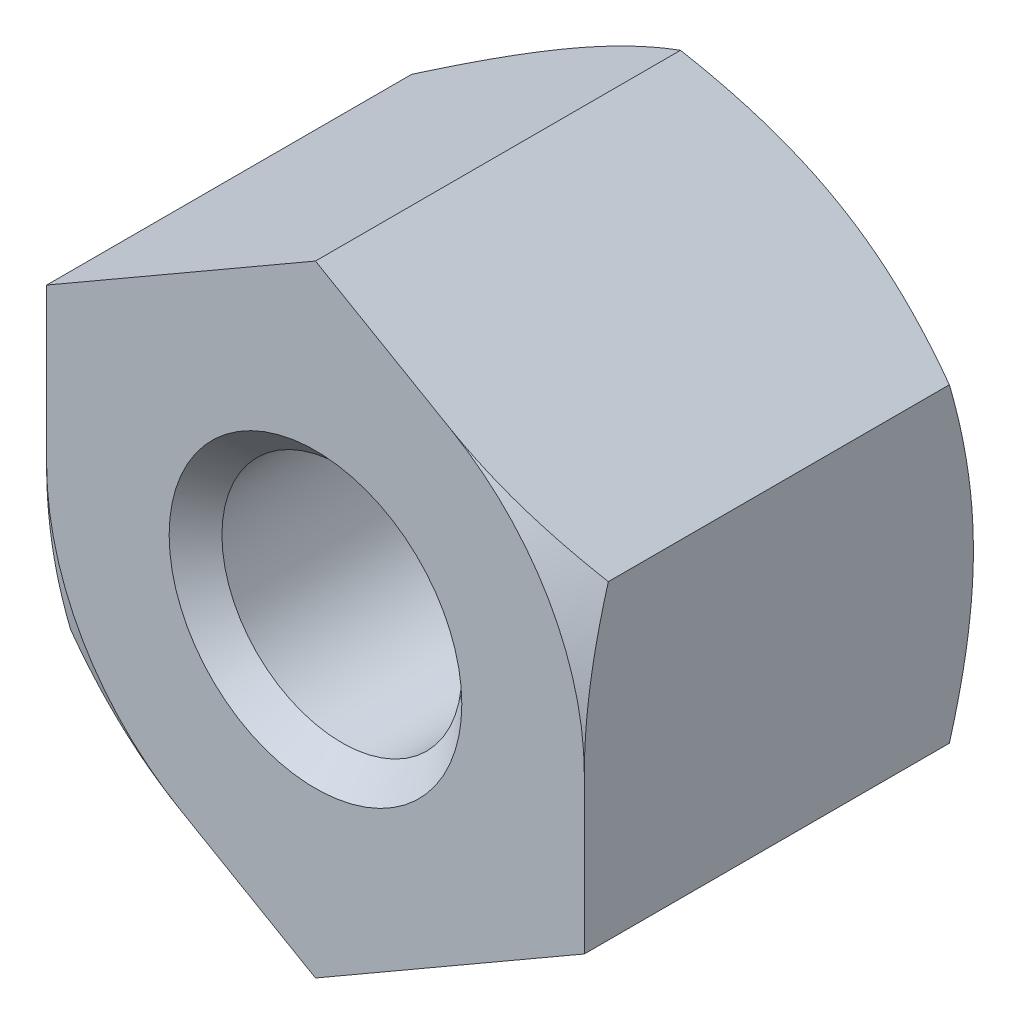
ISO-10303-21;
HEADER;
FILE_DESCRIPTION(('STEP AP214'),'2;1');
FILE_NAME('part.step','',(''),(''),'','','');
FILE_SCHEMA(('AUTOMOTIVE_DESIGN { 1 0 10303 214 1 1 1 1 }'));
ENDSEC;
DATA;
#1=APPLICATION_CONTEXT('core data for automotive mechanical design processes');
#2=APPLICATION_PROTOCOL_DEFINITION('international standard','automotive_design',2000,#1);
#3=PRODUCT_CONTEXT('',#1,'mechanical');
#4=PRODUCT('Part','Part','',(#3));
#5=PRODUCT_RELATED_PRODUCT_CATEGORY('part','',(#4));
#6=PRODUCT_DEFINITION_FORMATION('','',#4);
#7=PRODUCT_DEFINITION_CONTEXT('part definition',#1,'design');
#8=PRODUCT_DEFINITION('design','',#6,#7);
#9=PRODUCT_DEFINITION_SHAPE('','',#8);
#10=(LENGTH_UNIT() NAMED_UNIT(*) SI_UNIT(.MILLI.,.METRE.));
#11=(NAMED_UNIT(*) PLANE_ANGLE_UNIT() SI_UNIT($,.RADIAN.));
#12=(NAMED_UNIT(*) SI_UNIT($,.STERADIAN.) SOLID_ANGLE_UNIT());
#13=UNCERTAINTY_MEASURE_WITH_UNIT(LENGTH_MEASURE(1.E-05),#10,'distance_accuracy_value','');
#14=(GEOMETRIC_REPRESENTATION_CONTEXT(3) GLOBAL_UNCERTAINTY_ASSIGNED_CONTEXT((#13)) GLOBAL_UNIT_ASSIGNED_CONTEXT((#10,
#11,#12)) REPRESENTATION_CONTEXT('',''));
#15=CARTESIAN_POINT('',(0.,0.,0.));
#16=DIRECTION('',(0.,0.,1.));
#17=DIRECTION('',(1.,0.,0.));
#18=AXIS2_PLACEMENT_3D('',#15,#16,#17);
#19=CARTESIAN_POINT('',(0.,2.7559,-3.9878));
#20=DIRECTION('',(0.,0.,1.));
#21=DIRECTION('',(1.,0.,0.));
#22=AXIS2_PLACEMENT_3D('',#19,#20,#21);
#23=PLANE('',#22);
#24=CARTESIAN_POINT('',(0.,0.,-3.9878));
#25=DIRECTION('',(0.,0.,1.));
#26=DIRECTION('',(1.,0.,0.));
#27=AXIS2_PLACEMENT_3D('',#24,#25,#26);
#28=CIRCLE('',#27,1.4999969998319);
#29=CARTESIAN_POINT('',(1.4999969998319,0.,-3.9878));
#30=VERTEX_POINT('',#29);
#31=EDGE_CURVE('E13',#30,#30,#28,.T.);
#32=ORIENTED_EDGE('',*,*,#31,.T.);
#33=EDGE_LOOP('',(#32));
#34=FACE_BOUND('',#33,.T.);
#35=CARTESIAN_POINT('',(0.,0.,-3.98780000000443));
#36=DIRECTION('',(0.,0.,1.));
#37=DIRECTION('',(1.,0.,0.));
#38=AXIS2_PLACEMENT_3D('',#35,#36,#37);
#39=CIRCLE('',#38,2.75589999995418);
#40=CARTESIAN_POINT('',(1.37794999998855,2.38667941026969,-3.9877999999912));
#41=VERTEX_POINT('',#40);
#42=CARTESIAN_POINT('',(-1.37794999998855,2.3866794102697,-3.9877999999912));
#43=VERTEX_POINT('',#42);
#44=EDGE_CURVE('E223',#41,#43,#39,.T.);
#45=ORIENTED_EDGE('',*,*,#44,.F.);
#46=CARTESIAN_POINT('',(0.,0.,-3.98780000000443));
#47=DIRECTION('',(0.,0.,1.));
#48=DIRECTION('',(1.,0.,0.));
#49=AXIS2_PLACEMENT_3D('',#46,#47,#48);
#50=CIRCLE('',#49,2.75589999995418);
#51=CARTESIAN_POINT('',(2.75589999997709,0.,-3.9877999999912));
#52=VERTEX_POINT('',#51);
#53=EDGE_CURVE('E218',#52,#41,#50,.T.);
#54=ORIENTED_EDGE('',*,*,#53,.F.);
#55=CARTESIAN_POINT('',(0.,0.,-3.98780000000443));
#56=DIRECTION('',(0.,0.,1.));
#57=DIRECTION('',(1.,0.,0.));
#58=AXIS2_PLACEMENT_3D('',#55,#56,#57);
#59=CIRCLE('',#58,2.75589999995418);
#60=CARTESIAN_POINT('',(1.37794999998855,-2.3866794102697,-3.9877999999912));
#61=VERTEX_POINT('',#60);
#62=EDGE_CURVE('E224',#61,#52,#59,.T.);
#63=ORIENTED_EDGE('',*,*,#62,.F.);
#64=CARTESIAN_POINT('',(0.,0.,-3.98780000000443));
#65=DIRECTION('',(0.,0.,1.));
#66=DIRECTION('',(1.,0.,0.));
#67=AXIS2_PLACEMENT_3D('',#64,#65,#66);
#68=CIRCLE('',#67,2.75589999995418);
#69=CARTESIAN_POINT('',(-1.37794999998855,-2.38667941026969,-3.9877999999912));
#70=VERTEX_POINT('',#69);
#71=EDGE_CURVE('E455',#70,#61,#68,.T.);
#72=ORIENTED_EDGE('',*,*,#71,.F.);
#73=CARTESIAN_POINT('',(0.,0.,-3.98780000000443));
#74=DIRECTION('',(0.,0.,1.));
#75=DIRECTION('',(1.,0.,0.));
#76=AXIS2_PLACEMENT_3D('',#73,#74,#75);
#77=CIRCLE('',#76,2.75589999995418);
#78=CARTESIAN_POINT('',(-2.75589999997709,0.,-3.9877999999912));
#79=VERTEX_POINT('',#78);
#80=EDGE_CURVE('E151',#79,#70,#77,.T.);
#81=ORIENTED_EDGE('',*,*,#80,.F.);
#82=CARTESIAN_POINT('',(0.,0.,-3.98780000000443));
#83=DIRECTION('',(0.,0.,1.));
#84=DIRECTION('',(1.,0.,0.));
#85=AXIS2_PLACEMENT_3D('',#82,#83,#84);
#86=CIRCLE('',#85,2.75589999995418);
#87=EDGE_CURVE('E149',#43,#79,#86,.T.);
#88=ORIENTED_EDGE('',*,*,#87,.F.);
#89=EDGE_LOOP('',(#45,#54,#63,#72,#81,#88));
#90=FACE_BOUND('',#89,.T.);
#91=ADVANCED_FACE('F46',(#34,#90),#23,.F.);
#92=CARTESIAN_POINT('',(0.,-3.18223921371938,-3.9878));
#93=DIRECTION('',(0.5,-0.866025403784439,0.));
#94=DIRECTION('',(0.866025403784439,0.5,0.));
#95=AXIS2_PLACEMENT_3D('',#92,#93,#94);
#96=PLANE('',#95);
#97=CARTESIAN_POINT('',(1.37794999999893,-2.38667941028767,-3.98779999997673));
#98=CARTESIAN_POINT('',(1.43643624731878,-2.35291235965526,-3.98781126323813));
#99=CARTESIAN_POINT('',(1.4949196771574,-2.31914693569545,-3.98636704746725));
#100=CARTESIAN_POINT('',(1.61177170378955,-2.25168238666451,-3.98065137216487));
#101=CARTESIAN_POINT('',(1.67014032102252,-2.21798324979265,-3.97638047233835));
#102=CARTESIAN_POINT('',(1.78638570749878,-2.1508689446184,-3.96512326690887));
#103=CARTESIAN_POINT('',(1.84426347722602,-2.11745319868633,-3.95815063126584));
#104=CARTESIAN_POINT('',(1.95974326696349,-2.05078091099548,-3.94163993826357));
#105=CARTESIAN_POINT('',(2.01734527967496,-2.01752437345063,-3.93210181337872));
#106=CARTESIAN_POINT('',(2.18949891715776,-1.91813142450795,-3.89993386264114));
#107=CARTESIAN_POINT('',(2.30355042916174,-1.85228375335097,-3.87373484085225));
#108=CARTESIAN_POINT('',(2.53067266024991,-1.72115467209328,-3.81331319558092));
#109=CARTESIAN_POINT('',(2.64373545710587,-1.65587783589317,-3.77905050084585));
#110=CARTESIAN_POINT('',(2.75589999999545,-1.59111960686232,-3.74165294017212));
#111=B_SPLINE_CURVE_WITH_KNOTS('',3,(#97,#98,#99,#100,#101,#102,#103,#104,#105,#106,#107,#108,
#109,#110),.UNSPECIFIED.,.F.,.F.,(4,2,2,2,2,2,4),(0.,0.20258162786701,0.405123155023228,
0.606652990995222,0.808188131904857,1.21073019439024,1.61531651976063),.UNSPECIFIED.);
#112=CARTESIAN_POINT('',(2.75589999999741,-1.59111960686119,-3.74165294017146));
#113=VERTEX_POINT('',#112);
#114=EDGE_CURVE('E340',#61,#113,#111,.T.);
#115=ORIENTED_EDGE('',*,*,#114,.T.);
#116=DIRECTION('',(0.,0.,-1.));
#117=VECTOR('',#116,1.);
#118=CARTESIAN_POINT('',(2.7559,-1.59111960685969,-3.9878));
#119=LINE('',#118,#117);
#120=CARTESIAN_POINT('',(2.7559,-1.5911196068597,0.));
#121=VERTEX_POINT('',#120);
#122=EDGE_CURVE('E66',#121,#113,#119,.T.);
#123=ORIENTED_EDGE('',*,*,#122,.F.);
#124=DIRECTION('',(0.866025403784439,0.5,0.));
#125=VECTOR('',#124,1.);
#126=CARTESIAN_POINT('',(0.,-3.18223921371938,0.));
#127=LINE('',#126,#125);
#128=CARTESIAN_POINT('',(0.,-3.18223921371938,0.));
#129=VERTEX_POINT('',#128);
#130=EDGE_CURVE('E61',#129,#121,#127,.T.);
#131=ORIENTED_EDGE('',*,*,#130,.F.);
#132=DIRECTION('',(0.,0.,1.));
#133=VECTOR('',#132,1.);
#134=CARTESIAN_POINT('',(0.,-3.18223921371938,-3.9878));
#135=LINE('',#134,#133);
#136=CARTESIAN_POINT('',(0.,-3.18223921371639,-3.74165294017233));
#137=VERTEX_POINT('',#136);
#138=EDGE_CURVE('E552',#137,#129,#135,.T.);
#139=ORIENTED_EDGE('',*,*,#138,.F.);
#140=CARTESIAN_POINT('',(6.62214895842651E-12,-3.18223921372035,-3.74165294017483));
#141=CARTESIAN_POINT('',(0.112164542895147,-3.11748098468701,-3.77905050084688));
#142=CARTESIAN_POINT('',(0.225227339750624,-3.05220414848594,-3.81331319558126));
#143=CARTESIAN_POINT('',(0.452349570838366,-2.92107506722761,-3.87373484085208));
#144=CARTESIAN_POINT('',(0.566401082842394,-2.85522739607095,-3.89993386264115));
#145=CARTESIAN_POINT('',(0.738554720325154,-2.75583444712843,-3.93210181337875));
#146=CARTESIAN_POINT('',(0.796156733036603,-2.72257790958358,-3.94163993826358));
#147=CARTESIAN_POINT('',(0.911636522774006,-2.65590562189271,-3.95815063126584));
#148=CARTESIAN_POINT('',(0.969514292501204,-2.62248987596062,-3.9651232669089));
#149=CARTESIAN_POINT('',(1.08575967897747,-2.5553755707865,-3.97638047233831));
#150=CARTESIAN_POINT('',(1.14412829621047,-2.5216764339148,-3.98065137216474));
#151=CARTESIAN_POINT('',(1.26098032284232,-2.45421188488355,-3.98636704746736));
#152=CARTESIAN_POINT('',(1.31946375268059,-2.42044646092329,-3.98781126323857));
#153=CARTESIAN_POINT('',(1.37794999999969,-2.38667941028972,-3.98779999997797));
#154=B_SPLINE_CURVE_WITH_KNOTS('',3,(#140,#141,#142,#143,#144,#145,#146,#147,#148,#149,#150,
#151,#152,#153),.UNSPECIFIED.,.F.,.F.,(4,2,2,2,2,2,4),(0.,0.404586325370063,0.807128387855232,
1.00866352876478,1.21019336473671,1.41273489189279,1.61531651975961),.UNSPECIFIED.);
#155=EDGE_CURVE('E333',#137,#61,#154,.T.);
#156=ORIENTED_EDGE('',*,*,#155,.T.);
#157=EDGE_LOOP('',(#115,#123,#131,#139,#156));
#158=FACE_BOUND('',#157,.T.);
#159=ADVANCED_FACE('F271',(#158),#96,.T.);
#160=CARTESIAN_POINT('',(2.7559,-1.59111960685969,-3.9878));
#161=DIRECTION('',(1.,0.,0.));
#162=DIRECTION('',(0.,0.,-1.));
#163=AXIS2_PLACEMENT_3D('',#160,#161,#162);
#164=PLANE('',#163);
#165=CARTESIAN_POINT('',(2.75589999999785,0.,-3.98779999997673));
#166=CARTESIAN_POINT('',(2.75589999999923,0.0675341012672259,-3.98781126323813));
#167=CARTESIAN_POINT('',(2.75589999999979,0.13506494918781,-3.98636704746726));
#168=CARTESIAN_POINT('',(2.75590000000021,0.269994047250423,-3.98065137216487));
#169=CARTESIAN_POINT('',(2.75590000000006,0.337392320993872,-3.97638047233835));
#170=CARTESIAN_POINT('',(2.75589999999994,0.471620931342185,-3.96512326690887));
#171=CARTESIAN_POINT('',(2.75589999999998,0.53845242320639,-3.95815063126584));
#172=CARTESIAN_POINT('',(2.75590000000002,0.671796998588151,-3.94163993826358));
#173=CARTESIAN_POINT('',(2.75590000000001,0.738310073677827,-3.93210181337872));
#174=CARTESIAN_POINT('',(2.75589999999999,0.93709597156317,-3.89993386264115));
#175=CARTESIAN_POINT('',(2.75589999999999,1.06879131387713,-3.87373484085225));
#176=CARTESIAN_POINT('',(2.75590000000001,1.33104947639253,-3.81331319558092));
#177=CARTESIAN_POINT('',(2.75590000000001,1.46160314879276,-3.77905050084586));
#178=CARTESIAN_POINT('',(2.7559,1.59111960685444,-3.74165294017212));
#179=B_SPLINE_CURVE_WITH_KNOTS('',3,(#165,#166,#167,#168,#169,#170,#171,#172,#173,#174,#175,
#176,#177,#178),.UNSPECIFIED.,.F.,.F.,(4,2,2,2,2,2,4),(0.,0.20258162786701,0.405123155023229,
0.606652990995222,0.808188131904858,1.21073019439024,1.61531651976063),.UNSPECIFIED.);
#180=CARTESIAN_POINT('',(2.7559,1.5911196068567,-3.74165294017146));
#181=VERTEX_POINT('',#180);
#182=EDGE_CURVE('E283',#52,#181,#179,.T.);
#183=ORIENTED_EDGE('',*,*,#182,.T.);
#184=DIRECTION('',(0.,0.,1.));
#185=VECTOR('',#184,1.);
#186=CARTESIAN_POINT('',(2.7559,1.59111960685969,-3.9878));
#187=LINE('',#186,#185);
#188=CARTESIAN_POINT('',(2.7558999999969,1.5911196068579,-0.246147059831759));
#189=VERTEX_POINT('',#188);
#190=EDGE_CURVE('E316',#189,#181,#187,.F.);
#191=ORIENTED_EDGE('',*,*,#190,.F.);
#192=CARTESIAN_POINT('',(2.75590000000496,1.5911196068534,-0.24614705982876));
#193=CARTESIAN_POINT('',(2.75590000000173,1.46160314879141,-0.208749499157081));
#194=CARTESIAN_POINT('',(2.75590000000045,1.33104947639116,-0.174486804422873));
#195=CARTESIAN_POINT('',(2.75589999999955,1.06879131387597,-0.114065159152219));
#196=CARTESIAN_POINT('',(2.75589999999992,0.937095971562222,-0.087866137363155));
#197=CARTESIAN_POINT('',(2.75590000000004,0.738310073677125,-0.0556981866255793));
#198=CARTESIAN_POINT('',(2.75590000000001,0.671796998587512,-0.0461600617407657));
#199=CARTESIAN_POINT('',(2.75589999999999,0.53845242320588,-0.0296493687385312));
#200=CARTESIAN_POINT('',(2.7559,0.471620931341739,-0.0226767330954835));
#201=CARTESIAN_POINT('',(2.7559,0.337392320993579,-0.0114195276660877));
#202=CARTESIAN_POINT('',(2.7559,0.26999404725022,-0.00714862783966763));
#203=CARTESIAN_POINT('',(2.7559,0.13506494918781,-0.00143295253705481));
#204=CARTESIAN_POINT('',(2.7559,0.0675341012673401,1.12632341467819E-05));
#205=CARTESIAN_POINT('',(2.7559,2.38628218615068E-13,-2.64534834706604E-11));
#206=B_SPLINE_CURVE_WITH_KNOTS('',3,(#192,#193,#194,#195,#196,#197,#198,#199,#200,#201,#202,
#203,#204,#205),.UNSPECIFIED.,.F.,.F.,(4,2,2,2,2,2,4),(0.,0.404586325369769,0.807128387854663,
1.00866352876409,1.21019336473589,1.41273489189183,1.61531651975852),.UNSPECIFIED.);
#207=CARTESIAN_POINT('',(2.75589999997709,0.,-1.32268772606018E-11));
#208=VERTEX_POINT('',#207);
#209=EDGE_CURVE('E277',#189,#208,#206,.T.);
#210=ORIENTED_EDGE('',*,*,#209,.T.);
#211=DIRECTION('',(0.,-1.,0.));
#212=VECTOR('',#211,1.);
#213=CARTESIAN_POINT('',(2.7559,0.,0.));
#214=LINE('',#213,#212);
#215=EDGE_CURVE('E389',#208,#121,#214,.T.);
#216=ORIENTED_EDGE('',*,*,#215,.T.);
#217=ORIENTED_EDGE('',*,*,#122,.T.);
#218=CARTESIAN_POINT('',(2.75590000000414,-1.59111960685444,-3.74165294017483));
#219=CARTESIAN_POINT('',(2.75590000000145,-1.46160314879244,-3.77905050084688));
#220=CARTESIAN_POINT('',(2.75590000000038,-1.33104947639214,-3.81331319558126));
#221=CARTESIAN_POINT('',(2.75589999999962,-1.06879131387679,-3.87373484085208));
#222=CARTESIAN_POINT('',(2.75589999999993,-0.937095971562951,-3.89993386264115));
#223=CARTESIAN_POINT('',(2.75590000000003,-0.738310073677721,-3.93210181337875));
#224=CARTESIAN_POINT('',(2.75590000000001,-0.671796998588068,-3.94163993826358));
#225=CARTESIAN_POINT('',(2.75589999999999,-0.538452423206354,-3.95815063126584));
#226=CARTESIAN_POINT('',(2.7559,-0.471620931342173,-3.9651232669089));
#227=CARTESIAN_POINT('',(2.7559,-0.337392320993927,-3.97638047233831));
#228=CARTESIAN_POINT('',(2.7559,-0.269994047250523,-3.98065137216474));
#229=CARTESIAN_POINT('',(2.7559,-0.135064949188022,-3.98636704746737));
#230=CARTESIAN_POINT('',(2.7559,-0.0675341012675063,-3.98781126323857));
#231=CARTESIAN_POINT('',(2.7559,-3.5871181464797E-13,-3.98779999997797));
#232=B_SPLINE_CURVE_WITH_KNOTS('',3,(#218,#219,#220,#221,#222,#223,#224,#225,#226,#227,#228,
#229,#230,#231),.UNSPECIFIED.,.F.,.F.,(4,2,2,2,2,2,4),(0.,0.404586325370063,0.807128387855233,
1.00866352876478,1.21019336473671,1.41273489189279,1.61531651975962),.UNSPECIFIED.);
#233=EDGE_CURVE('E290',#113,#52,#232,.T.);
#234=ORIENTED_EDGE('',*,*,#233,.T.);
#235=EDGE_LOOP('',(#183,#191,#210,#216,#217,#234));
#236=FACE_BOUND('',#235,.T.);
#237=ADVANCED_FACE('F263',(#236),#164,.T.);
#238=CARTESIAN_POINT('',(-2.7559,-1.59111960685969,-3.9878));
#239=DIRECTION('',(-0.5,-0.866025403784439,0.));
#240=DIRECTION('',(0.866025403784439,-0.5,0.));
#241=AXIS2_PLACEMENT_3D('',#238,#239,#240);
#242=PLANE('',#241);
#243=CARTESIAN_POINT('',(-1.37794999999892,-2.38667941028767,-3.98779999997673));
#244=CARTESIAN_POINT('',(-1.31946375268044,-2.42044646092248,-3.98781126323813));
#245=CARTESIAN_POINT('',(-1.2609803228424,-2.45421188488326,-3.98636704746726));
#246=CARTESIAN_POINT('',(-1.14412829621066,-2.52167643391492,-3.98065137216487));
#247=CARTESIAN_POINT('',(-1.08575967897754,-2.55537557078652,-3.97638047233835));
#248=CARTESIAN_POINT('',(-0.969514292501163,-2.62248987596058,-3.96512326690887));
#249=CARTESIAN_POINT('',(-0.911636522773968,-2.65590562189272,-3.95815063126584));
#250=CARTESIAN_POINT('',(-0.796156733036529,-2.72257790958362,-3.94163993826358));
#251=CARTESIAN_POINT('',(-0.738554720325042,-2.75583444712845,-3.93210181337872));
#252=CARTESIAN_POINT('',(-0.566401082842227,-2.85522739607111,-3.89993386264115));
#253=CARTESIAN_POINT('',(-0.452349570838255,-2.92107506722809,-3.87373484085225));
#254=CARTESIAN_POINT('',(-0.225227339750095,-3.05220414848581,-3.81331319558092));
#255=CARTESIAN_POINT('',(-0.112164542894142,-3.11748098468593,-3.77905050084586));
#256=CARTESIAN_POINT('',(-4.54439924620634E-12,-3.18223921371675,-3.74165294017212));
#257=B_SPLINE_CURVE_WITH_KNOTS('',3,(#243,#244,#245,#246,#247,#248,#249,#250,#251,#252,#253,
#254,#255,#256),.UNSPECIFIED.,.F.,.F.,(4,2,2,2,2,2,4),(0.,0.202581627867011,0.40512315502323,
0.606652990995223,0.80818813190486,1.21073019439024,1.61531651976063),.UNSPECIFIED.);
#258=EDGE_CURVE('E245',#70,#137,#257,.T.);
#259=ORIENTED_EDGE('',*,*,#258,.T.);
#260=ORIENTED_EDGE('',*,*,#138,.T.);
#261=DIRECTION('',(0.866025403784439,-0.5,0.));
#262=VECTOR('',#261,1.);
#263=CARTESIAN_POINT('',(-2.7559,-1.59111960685969,0.));
#264=LINE('',#263,#262);
#265=CARTESIAN_POINT('',(-1.37794999998854,-2.38667941026969,-1.32265405221235E-11));
#266=VERTEX_POINT('',#265);
#267=EDGE_CURVE('E599',#266,#129,#264,.T.);
#268=ORIENTED_EDGE('',*,*,#267,.F.);
#269=CARTESIAN_POINT('',(-1.37794999999928,-2.38667941028829,-2.7280034240845E-11));
#270=CARTESIAN_POINT('',(-1.43643624731886,-2.3529123596555,1.12632338550769E-05));
#271=CARTESIAN_POINT('',(-1.49491967715733,-2.31914693569556,-0.00143295253712936));
#272=CARTESIAN_POINT('',(-1.61177170378933,-2.25168238666455,-0.00714862783958762));
#273=CARTESIAN_POINT('',(-1.67014032102228,-2.21798324979276,-0.0114195276660697));
#274=CARTESIAN_POINT('',(-1.78638570749849,-2.15086894461858,-0.0226767330955117));
#275=CARTESIAN_POINT('',(-1.84426347722568,-2.11745319868653,-0.0296493687385428));
#276=CARTESIAN_POINT('',(-1.95974326696307,-2.05078091099571,-0.0461600617407883));
#277=CARTESIAN_POINT('',(-2.01734527967451,-2.01752437345089,-0.0556981866256295));
#278=CARTESIAN_POINT('',(-2.1894989171572,-1.91813142450827,-0.0878661373631603));
#279=CARTESIAN_POINT('',(-2.30355042916111,-1.85228375335133,-0.114065159152022));
#280=CARTESIAN_POINT('',(-2.53067266024915,-1.72115467209371,-0.174486804423285));
#281=CARTESIAN_POINT('',(-2.64373545710503,-1.65587783589364,-0.208749499158314));
#282=CARTESIAN_POINT('',(-2.75589999999455,-1.59111960686283,-0.246147059832009));
#283=B_SPLINE_CURVE_WITH_KNOTS('',3,(#269,#270,#271,#272,#273,#274,#275,#276,#277,#278,#279,
#280,#281,#282),.UNSPECIFIED.,.F.,.F.,(4,2,2,2,2,2,4),(0.,0.202581627866857,0.405123155022932,
0.606652990994792,0.808188131904292,1.21073019438943,1.61531651975956),.UNSPECIFIED.);
#284=CARTESIAN_POINT('',(-2.7558999999969,-1.59111960686148,-0.246147059832791));
#285=VERTEX_POINT('',#284);
#286=EDGE_CURVE('E246',#266,#285,#283,.T.);
#287=ORIENTED_EDGE('',*,*,#286,.T.);
#288=DIRECTION('',(0.,0.,1.));
#289=VECTOR('',#288,1.);
#290=CARTESIAN_POINT('',(-2.7559,-1.59111960685969,-3.9878));
#291=LINE('',#290,#289);
#292=CARTESIAN_POINT('',(-2.75590001442721,-1.59111959853014,-3.74165293536153));
#293=VERTEX_POINT('',#292);
#294=EDGE_CURVE('E417',#293,#285,#291,.T.);
#295=ORIENTED_EDGE('',*,*,#294,.F.);
#296=CARTESIAN_POINT('',(-2.75590000443468,-1.59111956099086,-3.74165290788598));
#297=CARTESIAN_POINT('',(-2.64373547461798,-1.65587781065467,-3.77905048482185));
#298=CARTESIAN_POINT('',(-2.53067268140872,-1.72115465592323,-3.81331318677539));
#299=CARTESIAN_POINT('',(-2.30355044977443,-1.85228374538424,-3.87373483852748));
#300=CARTESIAN_POINT('',(-2.18949893362105,-1.91813141572379,-3.89993385963282));
#301=CARTESIAN_POINT('',(-2.01734529206962,-2.01752436593363,-3.93210181102895));
#302=CARTESIAN_POINT('',(-1.95974327843667,-2.05078090427422,-3.94163993640713));
#303=CARTESIAN_POINT('',(-1.84426348668548,-2.1174531933221,-3.9581506301294));
#304=CARTESIAN_POINT('',(-1.78638571586613,-2.15086893981539,-3.96512326600035));
#305=CARTESIAN_POINT('',(-1.67014032711554,-2.2179832462468,-3.97638047184681));
#306=CARTESIAN_POINT('',(-1.61177170870013,-2.25168238381515,-3.9806513718565));
#307=CARTESIAN_POINT('',(-1.49491967965102,-2.31914693426998,-3.98636704741385));
#308=CARTESIAN_POINT('',(-1.4364362485778,-2.35291235895723,-3.98781126325426));
#309=CARTESIAN_POINT('',(-1.37795000000031,-2.38667941028935,-3.98779999997797));
#310=B_SPLINE_CURVE_WITH_KNOTS('',3,(#296,#297,#298,#299,#300,#301,#302,#303,#304,#305,#306,
#307,#308,#309),.UNSPECIFIED.,.F.,.F.,(4,2,2,2,2,2,4),(0.,0.404586334807056,0.80712840594409,
1.00866355066115,1.21019339034386,1.4127349216442,1.61531655381522),.UNSPECIFIED.);
#311=EDGE_CURVE('E237',#293,#70,#310,.T.);
#312=ORIENTED_EDGE('',*,*,#311,.T.);
#313=EDGE_LOOP('',(#259,#260,#268,#287,#295,#312));
#314=FACE_BOUND('',#313,.T.);
#315=ADVANCED_FACE('F258',(#314),#242,.T.);
#316=CARTESIAN_POINT('',(2.7559,1.59111960685969,-3.9878));
#317=DIRECTION('',(0.5,0.866025403784439,0.));
#318=DIRECTION('',(-0.866025403784439,0.5,0.));
#319=AXIS2_PLACEMENT_3D('',#316,#317,#318);
#320=PLANE('',#319);
#321=CARTESIAN_POINT('',(1.37794999999892,2.38667941028767,-3.98779999997673));
#322=CARTESIAN_POINT('',(1.31946375166528,2.42044646150858,-3.9878112632389));
#323=CARTESIAN_POINT('',(1.26098032081231,2.45421188605533,-3.98636704741752));
#324=CARTESIAN_POINT('',(1.144128292157,2.5216764362553,-3.98065137191734));
#325=CARTESIAN_POINT('',(1.08575967391525,2.55537557370923,-3.9763804719436));
#326=CARTESIAN_POINT('',(0.969514285443621,2.62248988003525,-3.96512326613024));
#327=CARTESIAN_POINT('',(0.911636514729743,2.65590562653705,-3.95815063025135));
#328=CARTESIAN_POINT('',(0.796156723031954,2.72257791535977,-3.94163993669751));
#329=CARTESIAN_POINT('',(0.7385547093468,2.75583445346674,-3.93210181149693));
#330=CARTESIAN_POINT('',(0.566401068975778,2.85522740407691,-3.89993385971189));
#331=CARTESIAN_POINT('',(0.452349555079743,2.92107507632628,-3.8737348370896));
#332=CARTESIAN_POINT('',(0.225227320242535,3.0522041597485,-3.81331318995803));
#333=CARTESIAN_POINT('',(0.112164521530087,3.11748099702047,-3.77905049419421));
#334=CARTESIAN_POINT('',(-2.31870462705492E-08,3.18223922710643,-3.74165293244159));
#335=B_SPLINE_CURVE_WITH_KNOTS('',3,(#321,#322,#323,#324,#325,#326,#327,#328,#329,#330,#331,
#332,#333,#334),.UNSPECIFIED.,.F.,.F.,(4,2,2,2,2,2,4),(0.,0.202581631382394,0.405123162050576,
0.606653001493048,0.808188145873774,1.21073021526552,1.61531654762685),.UNSPECIFIED.);
#336=CARTESIAN_POINT('',(-1.44268115746455E-08,3.1822392220487,-3.74165293536166));
#337=VERTEX_POINT('',#336);
#338=EDGE_CURVE('E315',#41,#337,#335,.T.);
#339=ORIENTED_EDGE('',*,*,#338,.T.);
#340=DIRECTION('',(0.,0.,1.));
#341=VECTOR('',#340,1.);
#342=CARTESIAN_POINT('',(0.,3.18223921371938,-3.9878));
#343=LINE('',#342,#341);
#344=CARTESIAN_POINT('',(0.,3.18223921371938,0.));
#345=VERTEX_POINT('',#344);
#346=EDGE_CURVE('E142',#345,#337,#343,.F.);
#347=ORIENTED_EDGE('',*,*,#346,.F.);
#348=DIRECTION('',(-0.866025403784439,0.5,0.));
#349=VECTOR('',#348,1.);
#350=CARTESIAN_POINT('',(2.7559,1.59111960685969,0.));
#351=LINE('',#350,#349);
#352=CARTESIAN_POINT('',(1.37794999998855,2.38667941026969,-1.3226623742227E-11));
#353=VERTEX_POINT('',#352);
#354=EDGE_CURVE('E345',#353,#345,#351,.T.);
#355=ORIENTED_EDGE('',*,*,#354,.F.);
#356=CARTESIAN_POINT('',(1.37794999999928,2.38667941028829,-2.72799846351527E-11));
#357=CARTESIAN_POINT('',(1.43643624731886,2.3529123596555,1.12632338551612E-05));
#358=CARTESIAN_POINT('',(1.49491967715733,2.31914693569556,-0.00143295253712934));
#359=CARTESIAN_POINT('',(1.61177170378933,2.25168238666455,-0.00714862783958773));
#360=CARTESIAN_POINT('',(1.67014032102228,2.21798324979276,-0.0114195276660699));
#361=CARTESIAN_POINT('',(1.78638570749849,2.15086894461858,-0.0226767330955118));
#362=CARTESIAN_POINT('',(1.84426347722568,2.11745319868653,-0.0296493687385429));
#363=CARTESIAN_POINT('',(1.95974326696307,2.05078091099571,-0.0461600617407883));
#364=CARTESIAN_POINT('',(2.01734527967451,2.01752437345089,-0.0556981866256296));
#365=CARTESIAN_POINT('',(2.1894989171572,1.91813142450827,-0.0878661373631605));
#366=CARTESIAN_POINT('',(2.30355042916111,1.85228375335133,-0.114065159152022));
#367=CARTESIAN_POINT('',(2.53067266024915,1.72115467209371,-0.174486804423285));
#368=CARTESIAN_POINT('',(2.64373545710503,1.65587783589364,-0.208749499158314));
#369=CARTESIAN_POINT('',(2.75589999999455,1.59111960686283,-0.246147059832009));
#370=B_SPLINE_CURVE_WITH_KNOTS('',3,(#356,#357,#358,#359,#360,#361,#362,#363,#364,#365,#366,
#367,#368,#369),.UNSPECIFIED.,.F.,.F.,(4,2,2,2,2,2,4),(0.,0.202581627866857,0.405123155022932,
0.606652990994792,0.808188131904292,1.21073019438943,1.61531651975956),.UNSPECIFIED.);
#371=EDGE_CURVE('E322',#353,#189,#370,.T.);
#372=ORIENTED_EDGE('',*,*,#371,.T.);
#373=ORIENTED_EDGE('',*,*,#190,.T.);
#374=CARTESIAN_POINT('',(2.75589999999752,1.5911196068659,-3.74165294017483));
#375=CARTESIAN_POINT('',(2.6437354571063,1.65587783589457,-3.77905050084688));
#376=CARTESIAN_POINT('',(2.53067266024976,1.72115467209379,-3.81331319558126));
#377=CARTESIAN_POINT('',(2.30355042916126,1.85228375335081,-3.87373484085209));
#378=CARTESIAN_POINT('',(2.18949891715754,1.918131424508,-3.89993386264115));
#379=CARTESIAN_POINT('',(2.01734527967488,2.0175243734507,-3.93210181337876));
#380=CARTESIAN_POINT('',(1.95974326696341,2.05078091099551,-3.94163993826358));
#381=CARTESIAN_POINT('',(1.84426347722599,2.11745319868635,-3.95815063126584));
#382=CARTESIAN_POINT('',(1.7863857074988,2.15086894461845,-3.9651232669089));
#383=CARTESIAN_POINT('',(1.67014032102254,2.21798324979257,-3.97638047233831));
#384=CARTESIAN_POINT('',(1.61177170378953,2.25168238666427,-3.98065137216474));
#385=CARTESIAN_POINT('',(1.49491967715768,2.31914693569552,-3.98636704746737));
#386=CARTESIAN_POINT('',(1.43643624731941,2.35291235965578,-3.98781126323857));
#387=CARTESIAN_POINT('',(1.37795000000031,2.38667941028935,-3.98779999997797));
#388=B_SPLINE_CURVE_WITH_KNOTS('',3,(#374,#375,#376,#377,#378,#379,#380,#381,#382,#383,#384,
#385,#386,#387),.UNSPECIFIED.,.F.,.F.,(4,2,2,2,2,2,4),(0.,0.404586325370063,0.807128387855233,
1.00866352876478,1.21019336473671,1.41273489189279,1.61531651975962),.UNSPECIFIED.);
#389=EDGE_CURVE('E308',#181,#41,#388,.T.);
#390=ORIENTED_EDGE('',*,*,#389,.T.);
#391=EDGE_LOOP('',(#339,#347,#355,#372,#373,#390));
#392=FACE_BOUND('',#391,.T.);
#393=ADVANCED_FACE('F262',(#392),#320,.T.);
#394=CARTESIAN_POINT('',(-2.7559,1.59111960685969,-3.9878));
#395=DIRECTION('',(-1.,0.,0.));
#396=DIRECTION('',(0.,0.,1.));
#397=AXIS2_PLACEMENT_3D('',#394,#395,#396);
#398=PLANE('',#397);
#399=CARTESIAN_POINT('',(-2.7559,-1.59111952022479,-3.74165296517994));
#400=CARTESIAN_POINT('',(-2.7559,-1.46160306898975,-3.77905052236353));
#401=CARTESIAN_POINT('',(-2.7559,-1.33104940352433,-3.8133132137706));
#402=CARTESIAN_POINT('',(-2.7559,-1.06879125501324,-3.87373485302415));
#403=CARTESIAN_POINT('',(-2.7559,-0.937095919766943,-3.89993387211705));
#404=CARTESIAN_POINT('',(-2.7559,-0.738310032670302,-3.93210181946612));
#405=CARTESIAN_POINT('',(-2.7559,-0.671796961217699,-3.94163994332963));
#406=CARTESIAN_POINT('',(-2.7559,-0.538452393158708,-3.9581506345476));
#407=CARTESIAN_POINT('',(-2.7559,-0.471620904980194,-3.96512326942765));
#408=CARTESIAN_POINT('',(-2.7559,-0.337392302085009,-3.97638047361527));
#409=CARTESIAN_POINT('',(-2.7559,-0.269994032109274,-3.98065137296543));
#410=CARTESIAN_POINT('',(-2.7559,-0.135064941605588,-3.98636704762823));
#411=CARTESIAN_POINT('',(-2.7559,-0.0675340974762275,-3.98781126323608));
#412=CARTESIAN_POINT('',(-2.7559,-1.1138932428195E-12,-3.98779999997797));
#413=B_SPLINE_CURVE_WITH_KNOTS('',3,(#399,#400,#401,#402,#403,#404,#405,#406,#407,#408,#409,
#410,#411,#412),.UNSPECIFIED.,.F.,.F.,(4,2,2,2,2,2,4),(0.,0.404586302754847,0.807128342898323,
1.00866347257904,1.21019329732409,1.41273481311915,1.6153164296139),.UNSPECIFIED.);
#414=EDGE_CURVE('E141',#293,#79,#413,.T.);
#415=ORIENTED_EDGE('',*,*,#414,.F.);
#416=ORIENTED_EDGE('',*,*,#294,.T.);
#417=CARTESIAN_POINT('',(-2.75590000000496,-1.5911196068534,-0.24614705982876));
#418=CARTESIAN_POINT('',(-2.75590000000173,-1.46160314879141,-0.208749499157082));
#419=CARTESIAN_POINT('',(-2.75590000000045,-1.33104947639116,-0.174486804422873));
#420=CARTESIAN_POINT('',(-2.75589999999955,-1.06879131387597,-0.114065159152219));
#421=CARTESIAN_POINT('',(-2.75589999999992,-0.937095971562223,-0.0878661373631548));
#422=CARTESIAN_POINT('',(-2.75590000000004,-0.738310073677125,-0.0556981866255793));
#423=CARTESIAN_POINT('',(-2.75590000000001,-0.671796998587512,-0.0461600617407659));
#424=CARTESIAN_POINT('',(-2.75589999999999,-0.53845242320588,-0.0296493687385315));
#425=CARTESIAN_POINT('',(-2.7559,-0.47162093134174,-0.0226767330954836));
#426=CARTESIAN_POINT('',(-2.7559,-0.337392320993579,-0.0114195276660877));
#427=CARTESIAN_POINT('',(-2.7559,-0.26999404725022,-0.00714862783966761));
#428=CARTESIAN_POINT('',(-2.7559,-0.13506494918781,-0.00143295253705487));
#429=CARTESIAN_POINT('',(-2.7559,-0.0675341012673404,1.12632341466796E-05));
#430=CARTESIAN_POINT('',(-2.7559,-2.38781738924943E-13,-2.64535418848769E-11));
#431=B_SPLINE_CURVE_WITH_KNOTS('',3,(#417,#418,#419,#420,#421,#422,#423,#424,#425,#426,#427,
#428,#429,#430),.UNSPECIFIED.,.F.,.F.,(4,2,2,2,2,2,4),(0.,0.404586325369769,0.807128387854663,
1.00866352876409,1.21019336473589,1.41273489189183,1.61531651975852),.UNSPECIFIED.);
#432=CARTESIAN_POINT('',(-2.75589999997709,0.,-1.32267396442177E-11));
#433=VERTEX_POINT('',#432);
#434=EDGE_CURVE('E411',#285,#433,#431,.T.);
#435=ORIENTED_EDGE('',*,*,#434,.T.);
#436=DIRECTION('',(0.,1.,0.));
#437=VECTOR('',#436,1.);
#438=CARTESIAN_POINT('',(-2.7559,0.,0.));
#439=LINE('',#438,#437);
#440=CARTESIAN_POINT('',(-2.7559,1.5911196068597,0.));
#441=VERTEX_POINT('',#440);
#442=EDGE_CURVE('E136',#433,#441,#439,.T.);
#443=ORIENTED_EDGE('',*,*,#442,.T.);
#444=DIRECTION('',(0.,0.,1.));
#445=VECTOR('',#444,1.);
#446=CARTESIAN_POINT('',(-2.7559,1.59111960685969,-3.9878));
#447=LINE('',#446,#445);
#448=CARTESIAN_POINT('',(-2.7559,1.59111962352273,-3.74165293536039));
#449=VERTEX_POINT('',#448);
#450=EDGE_CURVE('E129',#449,#441,#447,.T.);
#451=ORIENTED_EDGE('',*,*,#450,.F.);
#452=CARTESIAN_POINT('',(-2.75589999999331,0.,-3.98779999997411));
#453=CARTESIAN_POINT('',(-2.7558999999976,0.0675341024399002,-3.98781126323796));
#454=CARTESIAN_POINT('',(-2.75589999999936,0.135064951532865,-3.98636704741725));
#455=CARTESIAN_POINT('',(-2.75590000000064,0.269994051932936,-3.9806513719175));
#456=CARTESIAN_POINT('',(-2.75590000000017,0.337392326841464,-3.97638047194352));
#457=CARTESIAN_POINT('',(-2.75589999999983,0.471620939494473,-3.9651232661299));
#458=CARTESIAN_POINT('',(-2.75589999999995,0.53845243249838,-3.95815063025097));
#459=CARTESIAN_POINT('',(-2.75590000000005,0.671797010144517,-3.94163993669697));
#460=CARTESIAN_POINT('',(-2.75590000000002,0.738310086358866,-3.93210181149628));
#461=CARTESIAN_POINT('',(-2.75589999999997,0.937095987580292,-3.89993385971086));
#462=CARTESIAN_POINT('',(-2.75589999999998,1.0687913320797,-3.87373483708831));
#463=CARTESIAN_POINT('',(-2.75590000000002,1.33104949892551,-3.81331318995615));
#464=CARTESIAN_POINT('',(-2.75590000000003,1.46160317347014,-3.77905049419199));
#465=CARTESIAN_POINT('',(-2.7559,1.59111963364276,-3.741652932439));
#466=B_SPLINE_CURVE_WITH_KNOTS('',3,(#452,#453,#454,#455,#456,#457,#458,#459,#460,#461,#462,
#463,#464,#465),.UNSPECIFIED.,.F.,.F.,(4,2,2,2,2,2,4),(0.,0.202581631383679,0.40512316205309,
0.606653001496714,0.808188145878612,1.21073021527252,1.61531654763613),.UNSPECIFIED.);
#467=EDGE_CURVE('E133',#79,#449,#466,.T.);
#468=ORIENTED_EDGE('',*,*,#467,.F.);
#469=EDGE_LOOP('',(#415,#416,#435,#443,#451,#468));
#470=FACE_BOUND('',#469,.T.);
#471=ADVANCED_FACE('F132',(#470),#398,.T.);
#472=CARTESIAN_POINT('',(0.,3.18223921371938,-3.9878));
#473=DIRECTION('',(-0.5,0.866025403784439,0.));
#474=DIRECTION('',(-0.866025403784439,-0.5,0.));
#475=AXIS2_PLACEMENT_3D('',#472,#473,#474);
#476=PLANE('',#475);
#477=CARTESIAN_POINT('',(-2.75589992497159,1.59111965017737,-3.74165296518007));
#478=CARTESIAN_POINT('',(-2.64373538799407,1.65587787579487,-3.77905052236364));
#479=CARTESIAN_POINT('',(-2.53067259714388,1.72115470852756,-3.81331321377069));
#480=CARTESIAN_POINT('',(-2.30355037818386,1.85228378278307,-3.87373485302421));
#481=CARTESIAN_POINT('',(-2.18949887230069,1.9181314504062,-3.8999338721171));
#482=CARTESIAN_POINT('',(-2.01734524416122,2.01752439395449,-3.93210181946615));
#483=CARTESIAN_POINT('',(-1.95974323459955,2.05078092968078,-3.94163994332966));
#484=CARTESIAN_POINT('',(-1.84426345120384,2.11745321371026,-3.95815063454761));
#485=CARTESIAN_POINT('',(-1.78638568466854,2.15086895779951,-3.96512326942766));
#486=CARTESIAN_POINT('',(-1.67014030464685,2.21798325924708,-3.97638047361528));
#487=CARTESIAN_POINT('',(-1.61177169067676,2.25168239423494,-3.98065137296543));
#488=CARTESIAN_POINT('',(-1.49491967059107,2.31914693948676,-3.98636704762823));
#489=CARTESIAN_POINT('',(-1.43643624403605,2.35291236155143,-3.98781126323608));
#490=CARTESIAN_POINT('',(-1.37795000000097,2.38667941028898,-3.98779999997797));
#491=B_SPLINE_CURVE_WITH_KNOTS('',3,(#477,#478,#479,#480,#481,#482,#483,#484,#485,#486,#487,
#488,#489,#490),.UNSPECIFIED.,.F.,.F.,(4,2,2,2,2,2,4),(0.,0.404586302754731,0.807128342898092,
1.00866347257875,1.21019329732375,1.41273481311874,1.61531642961344),.UNSPECIFIED.);
#492=EDGE_CURVE('E146',#449,#43,#491,.T.);
#493=ORIENTED_EDGE('',*,*,#492,.F.);
#494=ORIENTED_EDGE('',*,*,#450,.T.);
#495=DIRECTION('',(0.866025403784439,0.5,0.));
#496=VECTOR('',#495,1.);
#497=CARTESIAN_POINT('',(-1.37795,2.38667941028954,0.));
#498=LINE('',#497,#496);
#499=EDGE_CURVE('E386',#441,#345,#498,.T.);
#500=ORIENTED_EDGE('',*,*,#499,.T.);
#501=ORIENTED_EDGE('',*,*,#346,.T.);
#502=CARTESIAN_POINT('',(-1.37794999999666,2.38667941028375,-3.98779999997411));
#503=CARTESIAN_POINT('',(-1.31946375596353,2.42044645902511,-3.98781126323471));
#504=CARTESIAN_POINT('',(-1.26098032940924,2.4542118810914,-3.98636704762788));
#505=CARTESIAN_POINT('',(-1.14412830932393,2.52167642634449,-3.98065137296583));
#506=CARTESIAN_POINT('',(-1.08575969535349,2.555375561332,-3.9763804736154));
#507=CARTESIAN_POINT('',(-0.969514315331429,2.62248986277939,-3.96512326942756));
#508=CARTESIAN_POINT('',(-0.911636548796109,2.6559056068688,-3.95815063454758));
#509=CARTESIAN_POINT('',(-0.796156765400259,2.72257789089846,-3.94163994332965));
#510=CARTESIAN_POINT('',(-0.738554755838483,2.75583442662478,-3.93210181946611));
#511=CARTESIAN_POINT('',(-0.566401127698784,2.85522737017314,-3.89993387211697));
#512=CARTESIAN_POINT('',(-0.452349621815511,2.92107503779635,-3.87373485302405));
#513=CARTESIAN_POINT('',(-0.225227402855251,3.05220411205205,-3.81331321377045));
#514=CARTESIAN_POINT('',(-0.112164612004914,3.11748094478484,-3.77905052236334));
#515=CARTESIAN_POINT('',(-7.50272344419347E-08,3.18223917040239,-3.74165296517968));
#516=B_SPLINE_CURVE_WITH_KNOTS('',3,(#502,#503,#504,#505,#506,#507,#508,#509,#510,#511,#512,
#513,#514,#515),.UNSPECIFIED.,.F.,.F.,(4,2,2,2,2,2,4),(0.,0.202581616495175,0.405123132290567,
0.606652957035866,0.80818808671685,1.21073012686061,1.61531642961589),.UNSPECIFIED.);
#517=EDGE_CURVE('E156',#43,#337,#516,.T.);
#518=ORIENTED_EDGE('',*,*,#517,.F.);
#519=EDGE_LOOP('',(#493,#494,#500,#501,#518));
#520=FACE_BOUND('',#519,.T.);
#521=ADVANCED_FACE('F153',(#520),#476,.T.);
#522=CARTESIAN_POINT('',(0.,0.,-3.74017605781773));
#523=DIRECTION('',(0.,0.,1.));
#524=DIRECTION('',(1.,0.,0.));
#525=AXIS2_PLACEMENT_3D('',#522,#523,#524);
#526=CONICAL_SURFACE('',#525,3.18479724899134,1.04719755119591);
#527=ORIENTED_EDGE('',*,*,#80,.T.);
#528=ORIENTED_EDGE('',*,*,#311,.F.);
#529=ORIENTED_EDGE('',*,*,#414,.T.);
#530=EDGE_LOOP('',(#527,#528,#529));
#531=FACE_BOUND('',#530,.T.);
#532=ADVANCED_FACE('F188',(#531),#526,.T.);
#533=CARTESIAN_POINT('',(0.,0.,-3.74017605781773));
#534=DIRECTION('',(0.,0.,1.));
#535=DIRECTION('',(1.,0.,0.));
#536=AXIS2_PLACEMENT_3D('',#533,#534,#535);
#537=CONICAL_SURFACE('',#536,3.18479724899134,1.04719755119591);
#538=ORIENTED_EDGE('',*,*,#258,.F.);
#539=ORIENTED_EDGE('',*,*,#71,.T.);
#540=ORIENTED_EDGE('',*,*,#155,.F.);
#541=EDGE_LOOP('',(#538,#539,#540));
#542=FACE_BOUND('',#541,.T.);
#543=ADVANCED_FACE('F347',(#542),#537,.T.);
#544=CARTESIAN_POINT('',(0.,0.,-3.74017605781773));
#545=DIRECTION('',(0.,0.,1.));
#546=DIRECTION('',(1.,0.,0.));
#547=AXIS2_PLACEMENT_3D('',#544,#545,#546);
#548=CONICAL_SURFACE('',#547,3.18479724899134,1.04719755119591);
#549=ORIENTED_EDGE('',*,*,#114,.F.);
#550=ORIENTED_EDGE('',*,*,#62,.T.);
#551=ORIENTED_EDGE('',*,*,#233,.F.);
#552=EDGE_LOOP('',(#549,#550,#551));
#553=FACE_BOUND('',#552,.T.);
#554=ADVANCED_FACE('F302',(#553),#548,.T.);
#555=CARTESIAN_POINT('',(0.,0.,-3.74017605781773));
#556=DIRECTION('',(0.,0.,1.));
#557=DIRECTION('',(1.,0.,0.));
#558=AXIS2_PLACEMENT_3D('',#555,#556,#557);
#559=CONICAL_SURFACE('',#558,3.18479724899134,1.04719755119591);
#560=ORIENTED_EDGE('',*,*,#182,.F.);
#561=ORIENTED_EDGE('',*,*,#53,.T.);
#562=ORIENTED_EDGE('',*,*,#389,.F.);
#563=EDGE_LOOP('',(#560,#561,#562));
#564=FACE_BOUND('',#563,.T.);
#565=ADVANCED_FACE('F298',(#564),#559,.T.);
#566=CARTESIAN_POINT('',(0.,0.,-3.74017605781773));
#567=DIRECTION('',(0.,0.,1.));
#568=DIRECTION('',(1.,0.,0.));
#569=AXIS2_PLACEMENT_3D('',#566,#567,#568);
#570=CONICAL_SURFACE('',#569,3.18479724899134,1.04719755119591);
#571=ORIENTED_EDGE('',*,*,#338,.F.);
#572=ORIENTED_EDGE('',*,*,#44,.T.);
#573=ORIENTED_EDGE('',*,*,#517,.T.);
#574=EDGE_LOOP('',(#571,#572,#573));
#575=FACE_BOUND('',#574,.T.);
#576=ADVANCED_FACE('F301',(#575),#570,.T.);
#577=CARTESIAN_POINT('',(0.,0.,-3.74017605781773));
#578=DIRECTION('',(0.,0.,1.));
#579=DIRECTION('',(1.,0.,0.));
#580=AXIS2_PLACEMENT_3D('',#577,#578,#579);
#581=CONICAL_SURFACE('',#580,3.18479724899134,1.04719755119591);
#582=ORIENTED_EDGE('',*,*,#87,.T.);
#583=ORIENTED_EDGE('',*,*,#467,.T.);
#584=ORIENTED_EDGE('',*,*,#492,.T.);
#585=EDGE_LOOP('',(#582,#583,#584));
#586=FACE_BOUND('',#585,.T.);
#587=ADVANCED_FACE('F145',(#586),#581,.T.);
#588=CARTESIAN_POINT('',(0.,0.,-0.247623942186692));
#589=DIRECTION('',(0.,0.,-1.));
#590=DIRECTION('',(-1.,0.,0.));
#591=AXIS2_PLACEMENT_3D('',#588,#589,#590);
#592=CONICAL_SURFACE('',#591,3.18479724899134,1.04719755119591);
#593=CARTESIAN_POINT('',(0.,0.,0.));
#594=DIRECTION('',(0.,0.,-1.));
#595=DIRECTION('',(-1.,0.,0.));
#596=AXIS2_PLACEMENT_3D('',#593,#594,#595);
#597=CIRCLE('',#596,2.75589999995418);
#598=EDGE_CURVE('E430',#353,#208,#597,.T.);
#599=ORIENTED_EDGE('',*,*,#598,.T.);
#600=ORIENTED_EDGE('',*,*,#209,.F.);
#601=ORIENTED_EDGE('',*,*,#371,.F.);
#602=EDGE_LOOP('',(#599,#600,#601));
#603=FACE_BOUND('',#602,.T.);
#604=ADVANCED_FACE('F379',(#603),#592,.T.);
#605=CARTESIAN_POINT('',(0.,0.,-0.247623942186692));
#606=DIRECTION('',(0.,0.,-1.));
#607=DIRECTION('',(-1.,0.,0.));
#608=AXIS2_PLACEMENT_3D('',#605,#606,#607);
#609=CONICAL_SURFACE('',#608,3.18479724899134,1.04719755119591);
#610=ORIENTED_EDGE('',*,*,#286,.F.);
#611=CARTESIAN_POINT('',(0.,0.,0.));
#612=DIRECTION('',(0.,0.,-1.));
#613=DIRECTION('',(-1.,0.,0.));
#614=AXIS2_PLACEMENT_3D('',#611,#612,#613);
#615=CIRCLE('',#614,2.75589999995418);
#616=EDGE_CURVE('E391',#266,#433,#615,.T.);
#617=ORIENTED_EDGE('',*,*,#616,.T.);
#618=ORIENTED_EDGE('',*,*,#434,.F.);
#619=EDGE_LOOP('',(#610,#617,#618));
#620=FACE_BOUND('',#619,.T.);
#621=ADVANCED_FACE('F370',(#620),#609,.T.);
#622=CARTESIAN_POINT('',(0.,0.,0.));
#623=DIRECTION('',(0.,0.,-1.));
#624=DIRECTION('',(-1.,0.,0.));
#625=AXIS2_PLACEMENT_3D('',#622,#623,#624);
#626=PLANE('',#625);
#627=CARTESIAN_POINT('',(0.,0.,0.));
#628=DIRECTION('',(0.,0.,-1.));
#629=DIRECTION('',(-1.,0.,0.));
#630=AXIS2_PLACEMENT_3D('',#627,#628,#629);
#631=CIRCLE('',#630,1.49999699988874);
#632=CARTESIAN_POINT('',(-1.49999699988874,0.,0.));
#633=VERTEX_POINT('',#632);
#634=EDGE_CURVE('E384',#633,#633,#631,.T.);
#635=ORIENTED_EDGE('',*,*,#634,.T.);
#636=EDGE_LOOP('',(#635));
#637=FACE_BOUND('',#636,.T.);
#638=ORIENTED_EDGE('',*,*,#499,.F.);
#639=ORIENTED_EDGE('',*,*,#442,.F.);
#640=ORIENTED_EDGE('',*,*,#616,.F.);
#641=ORIENTED_EDGE('',*,*,#267,.T.);
#642=ORIENTED_EDGE('',*,*,#130,.T.);
#643=ORIENTED_EDGE('',*,*,#215,.F.);
#644=ORIENTED_EDGE('',*,*,#598,.F.);
#645=ORIENTED_EDGE('',*,*,#354,.T.);
#646=EDGE_LOOP('',(#638,#639,#640,#641,#642,#643,#644,#645));
#647=FACE_BOUND('',#646,.T.);
#648=ADVANCED_FACE('F362',(#637,#647),#626,.F.);
#649=CARTESIAN_POINT('',(0.,0.,-3.9878));
#650=DIRECTION('',(0.,0.,-1.));
#651=DIRECTION('',(-1.,0.,0.));
#652=AXIS2_PLACEMENT_3D('',#649,#650,#651);
#653=CYLINDRICAL_SURFACE('',#652,1.22949999971999);
#654=CARTESIAN_POINT('',(0.,0.,-0.270497000111916));
#655=DIRECTION('',(0.,0.,-1.));
#656=DIRECTION('',(-1.,0.,0.));
#657=AXIS2_PLACEMENT_3D('',#654,#655,#656);
#658=CIRCLE('',#657,1.22949999971999);
#659=CARTESIAN_POINT('',(-1.22949999971999,0.,-0.270497000111916));
#660=VERTEX_POINT('',#659);
#661=EDGE_CURVE('E54',#660,#660,#658,.F.);
#662=ORIENTED_EDGE('',*,*,#661,.T.);
#663=EDGE_LOOP('',(#662));
#664=FACE_BOUND('',#663,.T.);
#665=CARTESIAN_POINT('',(0.,0.,-3.71730299983124));
#666=DIRECTION('',(0.,0.,1.));
#667=DIRECTION('',(1.,0.,0.));
#668=AXIS2_PLACEMENT_3D('',#665,#666,#667);
#669=CIRCLE('',#668,1.22949999971999);
#670=CARTESIAN_POINT('',(1.22949999971999,0.,-3.71730299983124));
#671=VERTEX_POINT('',#670);
#672=EDGE_CURVE('E602',#671,#671,#669,.F.);
#673=ORIENTED_EDGE('',*,*,#672,.T.);
#674=EDGE_LOOP('',(#673));
#675=FACE_BOUND('',#674,.T.);
#676=ADVANCED_FACE('F366',(#664,#675),#653,.F.);
#677=CARTESIAN_POINT('',(0.,0.,0.));
#678=DIRECTION('',(0.,0.,1.));
#679=DIRECTION('',(1.,0.,0.));
#680=AXIS2_PLACEMENT_3D('',#677,#678,#679);
#681=CONICAL_SURFACE('',#680,1.49999699988874,0.785398163502516);
#682=ORIENTED_EDGE('',*,*,#661,.F.);
#683=EDGE_LOOP('',(#682));
#684=FACE_BOUND('',#683,.T.);
#685=ORIENTED_EDGE('',*,*,#634,.F.);
#686=EDGE_LOOP('',(#685));
#687=FACE_BOUND('',#686,.T.);
#688=ADVANCED_FACE('F376',(#684,#687),#681,.F.);
#689=CARTESIAN_POINT('',(0.,0.,-3.71730299983124));
#690=DIRECTION('',(0.,0.,-1.));
#691=DIRECTION('',(-1.,0.,0.));
#692=AXIS2_PLACEMENT_3D('',#689,#690,#691);
#693=CONICAL_SURFACE('',#692,1.22949999971999,0.785398163292379);
#694=ORIENTED_EDGE('',*,*,#31,.F.);
#695=EDGE_LOOP('',(#694));
#696=FACE_BOUND('',#695,.T.);
#697=ORIENTED_EDGE('',*,*,#672,.F.);
#698=EDGE_LOOP('',(#697));
#699=FACE_BOUND('',#698,.T.);
#700=ADVANCED_FACE('F48',(#696,#699),#693,.F.);
#701=CLOSED_SHELL('',(#91,#159,#237,#315,#393,#471,#521,#532,#543,#554,#565,#576,#587,#604,#621,
#648,#676,#688,#700));
#702=MANIFOLD_SOLID_BREP('B2',#701);
#703=ADVANCED_BREP_SHAPE_REPRESENTATION('',(#18,#702),#14);
#704=SHAPE_DEFINITION_REPRESENTATION(#9,#703);
ENDSEC;
END-ISO-10303-21;
